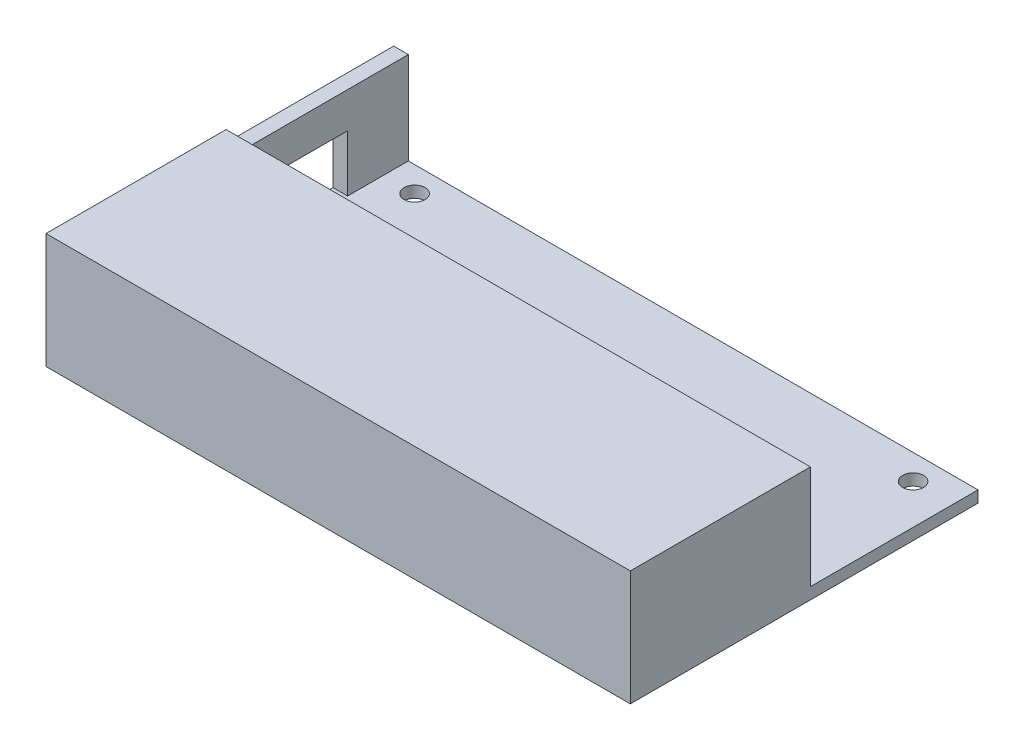
ISO-10303-21;
HEADER;
FILE_DESCRIPTION(('STEP AP214'),'2;1');
FILE_NAME('part.step','',(''),(''),'','','');
FILE_SCHEMA(('AUTOMOTIVE_DESIGN { 1 0 10303 214 1 1 1 1 }'));
ENDSEC;
DATA;
#1=APPLICATION_CONTEXT('core data for automotive mechanical design processes');
#2=APPLICATION_PROTOCOL_DEFINITION('international standard','automotive_design',2000,#1);
#3=PRODUCT_CONTEXT('',#1,'mechanical');
#4=PRODUCT('Part','Part','',(#3));
#5=PRODUCT_RELATED_PRODUCT_CATEGORY('part','',(#4));
#6=PRODUCT_DEFINITION_FORMATION('','',#4);
#7=PRODUCT_DEFINITION_CONTEXT('part definition',#1,'design');
#8=PRODUCT_DEFINITION('design','',#6,#7);
#9=PRODUCT_DEFINITION_SHAPE('','',#8);
#10=(LENGTH_UNIT() NAMED_UNIT(*) SI_UNIT(.MILLI.,.METRE.));
#11=(NAMED_UNIT(*) PLANE_ANGLE_UNIT() SI_UNIT($,.RADIAN.));
#12=(NAMED_UNIT(*) SI_UNIT($,.STERADIAN.) SOLID_ANGLE_UNIT());
#13=UNCERTAINTY_MEASURE_WITH_UNIT(LENGTH_MEASURE(1.E-05),#10,'distance_accuracy_value','');
#14=(GEOMETRIC_REPRESENTATION_CONTEXT(3) GLOBAL_UNCERTAINTY_ASSIGNED_CONTEXT((#13)) GLOBAL_UNIT_ASSIGNED_CONTEXT((#10,
#11,#12)) REPRESENTATION_CONTEXT('',''));
#15=CARTESIAN_POINT('',(0.,0.,0.));
#16=DIRECTION('',(0.,0.,1.));
#17=DIRECTION('',(1.,0.,0.));
#18=AXIS2_PLACEMENT_3D('',#15,#16,#17);
#19=CARTESIAN_POINT('',(69.75,27.5,41.5));
#20=DIRECTION('',(-1.,0.,0.));
#21=DIRECTION('',(0.,0.,1.));
#22=AXIS2_PLACEMENT_3D('',#19,#20,#21);
#23=PLANE('',#22);
#24=DIRECTION('',(0.,-1.,0.));
#25=VECTOR('',#24,1.);
#26=CARTESIAN_POINT('',(69.75,27.5,-41.5));
#27=LINE('',#26,#25);
#28=CARTESIAN_POINT('',(69.75,2.75,-41.5));
#29=VERTEX_POINT('',#28);
#30=CARTESIAN_POINT('',(69.75,0.,-41.5));
#31=VERTEX_POINT('',#30);
#32=EDGE_CURVE('E11',#29,#31,#27,.T.);
#33=ORIENTED_EDGE('',*,*,#32,.F.);
#34=DIRECTION('',(0.,0.,-1.));
#35=VECTOR('',#34,1.);
#36=CARTESIAN_POINT('',(69.75,2.75,-1.5));
#37=LINE('',#36,#35);
#38=CARTESIAN_POINT('',(69.75,2.75,-1.5));
#39=VERTEX_POINT('',#38);
#40=EDGE_CURVE('E362',#39,#29,#37,.T.);
#41=ORIENTED_EDGE('',*,*,#40,.F.);
#42=DIRECTION('',(0.,-1.,0.));
#43=VECTOR('',#42,1.);
#44=CARTESIAN_POINT('',(69.75,23.25,-1.5));
#45=LINE('',#44,#43);
#46=CARTESIAN_POINT('',(69.75,27.5,-1.5));
#47=VERTEX_POINT('',#46);
#48=EDGE_CURVE('E354',#47,#39,#45,.T.);
#49=ORIENTED_EDGE('',*,*,#48,.F.);
#50=DIRECTION('',(0.,0.,-1.));
#51=VECTOR('',#50,1.);
#52=CARTESIAN_POINT('',(69.75,27.5,41.5));
#53=LINE('',#52,#51);
#54=CARTESIAN_POINT('',(69.75,27.5,41.5));
#55=VERTEX_POINT('',#54);
#56=EDGE_CURVE('E225',#55,#47,#53,.T.);
#57=ORIENTED_EDGE('',*,*,#56,.F.);
#58=DIRECTION('',(0.,-1.,0.));
#59=VECTOR('',#58,1.);
#60=CARTESIAN_POINT('',(69.75,27.5,41.5));
#61=LINE('',#60,#59);
#62=CARTESIAN_POINT('',(69.75,0.,41.5));
#63=VERTEX_POINT('',#62);
#64=EDGE_CURVE('E226',#55,#63,#61,.T.);
#65=ORIENTED_EDGE('',*,*,#64,.T.);
#66=DIRECTION('',(0.,0.,-1.));
#67=VECTOR('',#66,1.);
#68=CARTESIAN_POINT('',(69.75,0.,41.5));
#69=LINE('',#68,#67);
#70=EDGE_CURVE('E219',#63,#31,#69,.T.);
#71=ORIENTED_EDGE('',*,*,#70,.T.);
#72=EDGE_LOOP('',(#33,#41,#49,#57,#65,#71));
#73=FACE_BOUND('',#72,.T.);
#74=ADVANCED_FACE('F39',(#73),#23,.F.);
#75=CARTESIAN_POINT('',(-69.75,27.5,-41.5));
#76=DIRECTION('',(0.,0.,1.));
#77=DIRECTION('',(1.,0.,0.));
#78=AXIS2_PLACEMENT_3D('',#75,#76,#77);
#79=PLANE('',#78);
#80=DIRECTION('',(-1.,0.,0.));
#81=VECTOR('',#80,1.);
#82=CARTESIAN_POINT('',(-66.2541319088615,2.74999999999999,-41.5));
#83=LINE('',#82,#81);
#84=CARTESIAN_POINT('',(-66.2541319088615,2.74999999999999,-41.5));
#85=VERTEX_POINT('',#84);
#86=EDGE_CURVE('E366',#29,#85,#83,.T.);
#87=ORIENTED_EDGE('',*,*,#86,.F.);
#88=ORIENTED_EDGE('',*,*,#32,.T.);
#89=DIRECTION('',(-1.,0.,0.));
#90=VECTOR('',#89,1.);
#91=CARTESIAN_POINT('',(-69.75,0.,-41.5));
#92=LINE('',#91,#90);
#93=CARTESIAN_POINT('',(-69.75,0.,-41.5));
#94=VERTEX_POINT('',#93);
#95=EDGE_CURVE('E214',#31,#94,#92,.T.);
#96=ORIENTED_EDGE('',*,*,#95,.T.);
#97=DIRECTION('',(0.,-1.,0.));
#98=VECTOR('',#97,1.);
#99=CARTESIAN_POINT('',(-69.75,27.5,-41.5));
#100=LINE('',#99,#98);
#101=CARTESIAN_POINT('',(-69.75,24.75,-41.5));
#102=VERTEX_POINT('',#101);
#103=EDGE_CURVE('E47',#102,#94,#100,.T.);
#104=ORIENTED_EDGE('',*,*,#103,.F.);
#105=DIRECTION('',(-1.,0.,0.));
#106=VECTOR('',#105,1.);
#107=CARTESIAN_POINT('',(-67.373989773948,24.75,-41.5));
#108=LINE('',#107,#106);
#109=CARTESIAN_POINT('',(-66.2541319088615,24.75,-41.5));
#110=VERTEX_POINT('',#109);
#111=EDGE_CURVE('E192',#110,#102,#108,.T.);
#112=ORIENTED_EDGE('',*,*,#111,.F.);
#113=DIRECTION('',(0.,1.,0.));
#114=VECTOR('',#113,1.);
#115=CARTESIAN_POINT('',(-66.2541319088615,2.74999999999999,-41.5));
#116=LINE('',#115,#114);
#117=EDGE_CURVE('E374',#85,#110,#116,.T.);
#118=ORIENTED_EDGE('',*,*,#117,.F.);
#119=EDGE_LOOP('',(#87,#88,#96,#104,#112,#118));
#120=FACE_BOUND('',#119,.T.);
#121=ADVANCED_FACE('F243',(#120),#79,.F.);
#122=CARTESIAN_POINT('',(-69.75,27.5,41.5));
#123=DIRECTION('',(1.,0.,0.));
#124=DIRECTION('',(0.,0.,-1.));
#125=AXIS2_PLACEMENT_3D('',#122,#123,#124);
#126=PLANE('',#125);
#127=DIRECTION('',(0.,0.,1.));
#128=VECTOR('',#127,1.);
#129=CARTESIAN_POINT('',(-69.75,0.,41.5));
#130=LINE('',#129,#128);
#131=CARTESIAN_POINT('',(-69.75,0.,-5.50000000000001));
#132=VERTEX_POINT('',#131);
#133=EDGE_CURVE('E213',#94,#132,#130,.T.);
#134=ORIENTED_EDGE('',*,*,#133,.T.);
#135=DIRECTION('',(0.,-1.,0.));
#136=VECTOR('',#135,1.);
#137=CARTESIAN_POINT('',(-69.75,2.74999999999999,-5.50000000000001));
#138=LINE('',#137,#136);
#139=CARTESIAN_POINT('',(-69.75,16.25,-5.50000000000001));
#140=VERTEX_POINT('',#139);
#141=EDGE_CURVE('E284',#140,#132,#138,.T.);
#142=ORIENTED_EDGE('',*,*,#141,.F.);
#143=DIRECTION('',(0.,0.,-1.));
#144=VECTOR('',#143,1.);
#145=CARTESIAN_POINT('',(-69.75,16.25,24.5));
#146=LINE('',#145,#144);
#147=CARTESIAN_POINT('',(-69.75,16.25,24.5));
#148=VERTEX_POINT('',#147);
#149=EDGE_CURVE('E188',#148,#140,#146,.T.);
#150=ORIENTED_EDGE('',*,*,#149,.F.);
#151=DIRECTION('',(0.,1.,0.));
#152=VECTOR('',#151,1.);
#153=CARTESIAN_POINT('',(-69.75,2.75,24.5));
#154=LINE('',#153,#152);
#155=CARTESIAN_POINT('',(-69.75,0.,24.5));
#156=VERTEX_POINT('',#155);
#157=EDGE_CURVE('E178',#156,#148,#154,.T.);
#158=ORIENTED_EDGE('',*,*,#157,.F.);
#159=CARTESIAN_POINT('',(-69.75,0.,41.5));
#160=VERTEX_POINT('',#159);
#161=EDGE_CURVE('E185',#156,#160,#130,.T.);
#162=ORIENTED_EDGE('',*,*,#161,.T.);
#163=DIRECTION('',(0.,-1.,0.));
#164=VECTOR('',#163,1.);
#165=CARTESIAN_POINT('',(-69.75,27.5,41.5));
#166=LINE('',#165,#164);
#167=CARTESIAN_POINT('',(-69.75,27.5,41.5));
#168=VERTEX_POINT('',#167);
#169=EDGE_CURVE('E230',#168,#160,#166,.T.);
#170=ORIENTED_EDGE('',*,*,#169,.F.);
#171=DIRECTION('',(0.,0.,1.));
#172=VECTOR('',#171,1.);
#173=CARTESIAN_POINT('',(-69.75,27.5,41.5));
#174=LINE('',#173,#172);
#175=CARTESIAN_POINT('',(-69.75,27.5,-1.5));
#176=VERTEX_POINT('',#175);
#177=EDGE_CURVE('E414',#176,#168,#174,.T.);
#178=ORIENTED_EDGE('',*,*,#177,.F.);
#179=DIRECTION('',(0.,1.,0.));
#180=VECTOR('',#179,1.);
#181=CARTESIAN_POINT('',(-69.75,24.75,-1.5));
#182=LINE('',#181,#180);
#183=CARTESIAN_POINT('',(-69.75,24.75,-1.5));
#184=VERTEX_POINT('',#183);
#185=EDGE_CURVE('E348',#184,#176,#182,.T.);
#186=ORIENTED_EDGE('',*,*,#185,.F.);
#187=DIRECTION('',(0.,0.,-1.));
#188=VECTOR('',#187,1.);
#189=CARTESIAN_POINT('',(-69.75,24.75,-1.5));
#190=LINE('',#189,#188);
#191=EDGE_CURVE('E239',#184,#102,#190,.T.);
#192=ORIENTED_EDGE('',*,*,#191,.T.);
#193=ORIENTED_EDGE('',*,*,#103,.T.);
#194=EDGE_LOOP('',(#134,#142,#150,#158,#162,#170,#178,#186,#192,#193));
#195=FACE_BOUND('',#194,.T.);
#196=DIRECTION('',(0.,0.,-1.));
#197=VECTOR('',#196,1.);
#198=CARTESIAN_POINT('',(-69.75,16.25,-10.5));
#199=LINE('',#198,#197);
#200=CARTESIAN_POINT('',(-69.75,16.25,-10.5));
#201=VERTEX_POINT('',#200);
#202=CARTESIAN_POINT('',(-69.75,16.25,-27.));
#203=VERTEX_POINT('',#202);
#204=EDGE_CURVE('E311',#201,#203,#199,.T.);
#205=ORIENTED_EDGE('',*,*,#204,.F.);
#206=DIRECTION('',(0.,1.,0.));
#207=VECTOR('',#206,1.);
#208=CARTESIAN_POINT('',(-69.75,2.74999999999999,-10.5));
#209=LINE('',#208,#207);
#210=CARTESIAN_POINT('',(-69.75,2.74999999999999,-10.5));
#211=VERTEX_POINT('',#210);
#212=EDGE_CURVE('E315',#211,#201,#209,.T.);
#213=ORIENTED_EDGE('',*,*,#212,.F.);
#214=DIRECTION('',(0.,0.,1.));
#215=VECTOR('',#214,1.);
#216=CARTESIAN_POINT('',(-69.75,2.74999999999999,-10.5));
#217=LINE('',#216,#215);
#218=CARTESIAN_POINT('',(-69.75,2.74999999999999,-27.));
#219=VERTEX_POINT('',#218);
#220=EDGE_CURVE('E295',#219,#211,#217,.T.);
#221=ORIENTED_EDGE('',*,*,#220,.F.);
#222=DIRECTION('',(0.,-1.,0.));
#223=VECTOR('',#222,1.);
#224=CARTESIAN_POINT('',(-69.75,2.74999999999999,-27.));
#225=LINE('',#224,#223);
#226=EDGE_CURVE('E308',#203,#219,#225,.T.);
#227=ORIENTED_EDGE('',*,*,#226,.F.);
#228=EDGE_LOOP('',(#205,#213,#221,#227));
#229=FACE_BOUND('',#228,.T.);
#230=ADVANCED_FACE('F181',(#195,#229),#126,.F.);
#231=CARTESIAN_POINT('',(-69.75,27.5,41.5));
#232=DIRECTION('',(0.,0.,-1.));
#233=DIRECTION('',(-1.,0.,0.));
#234=AXIS2_PLACEMENT_3D('',#231,#232,#233);
#235=PLANE('',#234);
#236=DIRECTION('',(1.,0.,0.));
#237=VECTOR('',#236,1.);
#238=CARTESIAN_POINT('',(-69.75,0.,41.5));
#239=LINE('',#238,#237);
#240=EDGE_CURVE('E211',#160,#63,#239,.T.);
#241=ORIENTED_EDGE('',*,*,#240,.T.);
#242=ORIENTED_EDGE('',*,*,#64,.F.);
#243=DIRECTION('',(1.,0.,0.));
#244=VECTOR('',#243,1.);
#245=CARTESIAN_POINT('',(-69.75,27.5,41.5));
#246=LINE('',#245,#244);
#247=EDGE_CURVE('E231',#168,#55,#246,.T.);
#248=ORIENTED_EDGE('',*,*,#247,.F.);
#249=ORIENTED_EDGE('',*,*,#169,.T.);
#250=EDGE_LOOP('',(#241,#242,#248,#249));
#251=FACE_BOUND('',#250,.T.);
#252=ADVANCED_FACE('F426',(#251),#235,.F.);
#253=CARTESIAN_POINT('',(0.,27.5,0.));
#254=DIRECTION('',(0.,-1.,0.));
#255=DIRECTION('',(0.,0.,-1.));
#256=AXIS2_PLACEMENT_3D('',#253,#254,#255);
#257=PLANE('',#256);
#258=ORIENTED_EDGE('',*,*,#56,.T.);
#259=DIRECTION('',(1.,0.,0.));
#260=VECTOR('',#259,1.);
#261=CARTESIAN_POINT('',(-69.75,27.5,-1.5));
#262=LINE('',#261,#260);
#263=EDGE_CURVE('E351',#176,#47,#262,.T.);
#264=ORIENTED_EDGE('',*,*,#263,.F.);
#265=ORIENTED_EDGE('',*,*,#177,.T.);
#266=ORIENTED_EDGE('',*,*,#247,.T.);
#267=EDGE_LOOP('',(#258,#264,#265,#266));
#268=FACE_BOUND('',#267,.T.);
#269=ADVANCED_FACE('F430',(#268),#257,.F.);
#270=CARTESIAN_POINT('',(0.,0.,0.));
#271=DIRECTION('',(0.,-1.,0.));
#272=DIRECTION('',(0.,0.,-1.));
#273=AXIS2_PLACEMENT_3D('',#270,#271,#272);
#274=PLANE('',#273);
#275=CARTESIAN_POINT('',(60.25,0.,-35.5));
#276=DIRECTION('',(0.,1.,0.));
#277=DIRECTION('',(0.,0.,1.));
#278=AXIS2_PLACEMENT_3D('',#275,#276,#277);
#279=CIRCLE('',#278,2.50000000000001);
#280=CARTESIAN_POINT('',(60.25,0.,-33.));
#281=VERTEX_POINT('',#280);
#282=EDGE_CURVE('E261',#281,#281,#279,.T.);
#283=ORIENTED_EDGE('',*,*,#282,.T.);
#284=EDGE_LOOP('',(#283));
#285=FACE_BOUND('',#284,.T.);
#286=DIRECTION('',(-1.,0.,0.));
#287=VECTOR('',#286,1.);
#288=CARTESIAN_POINT('',(-69.75,0.,-5.50000000000001));
#289=LINE('',#288,#287);
#290=CARTESIAN_POINT('',(-48.75,0.,-5.50000000000001));
#291=VERTEX_POINT('',#290);
#292=EDGE_CURVE('E247',#291,#132,#289,.T.);
#293=ORIENTED_EDGE('',*,*,#292,.T.);
#294=ORIENTED_EDGE('',*,*,#133,.F.);
#295=ORIENTED_EDGE('',*,*,#95,.F.);
#296=ORIENTED_EDGE('',*,*,#70,.F.);
#297=ORIENTED_EDGE('',*,*,#240,.F.);
#298=ORIENTED_EDGE('',*,*,#161,.F.);
#299=DIRECTION('',(1.,0.,0.));
#300=VECTOR('',#299,1.);
#301=CARTESIAN_POINT('',(-69.75,0.,24.5));
#302=LINE('',#301,#300);
#303=CARTESIAN_POINT('',(-48.75,0.,24.5));
#304=VERTEX_POINT('',#303);
#305=EDGE_CURVE('E195',#156,#304,#302,.T.);
#306=ORIENTED_EDGE('',*,*,#305,.T.);
#307=DIRECTION('',(0.,0.,-1.));
#308=VECTOR('',#307,1.);
#309=CARTESIAN_POINT('',(-48.75,0.,-5.50000000000001));
#310=LINE('',#309,#308);
#311=EDGE_CURVE('E203',#304,#291,#310,.T.);
#312=ORIENTED_EDGE('',*,*,#311,.T.);
#313=EDGE_LOOP('',(#293,#294,#295,#296,#297,#298,#306,#312));
#314=FACE_BOUND('',#313,.T.);
#315=CARTESIAN_POINT('',(-58.7541319088615,0.,-35.5));
#316=DIRECTION('',(0.,1.,0.));
#317=DIRECTION('',(0.,0.,1.));
#318=AXIS2_PLACEMENT_3D('',#315,#316,#317);
#319=CIRCLE('',#318,2.5);
#320=CARTESIAN_POINT('',(-58.7541319088615,0.,-33.));
#321=VERTEX_POINT('',#320);
#322=EDGE_CURVE('E277',#321,#321,#319,.T.);
#323=ORIENTED_EDGE('',*,*,#322,.T.);
#324=EDGE_LOOP('',(#323));
#325=FACE_BOUND('',#324,.T.);
#326=ADVANCED_FACE('F208',(#285,#314,#325),#274,.T.);
#327=CARTESIAN_POINT('',(66.2541319088616,2.74999999999999,38.5));
#328=DIRECTION('',(1.,0.,0.));
#329=DIRECTION('',(0.,0.,-1.));
#330=AXIS2_PLACEMENT_3D('',#327,#328,#329);
#331=PLANE('',#330);
#332=DIRECTION('',(0.,0.,-1.));
#333=VECTOR('',#332,1.);
#334=CARTESIAN_POINT('',(66.2541319088616,24.75,38.5));
#335=LINE('',#334,#333);
#336=CARTESIAN_POINT('',(66.2541319088616,24.75,38.5));
#337=VERTEX_POINT('',#336);
#338=CARTESIAN_POINT('',(66.2541319088616,24.75,-1.5));
#339=VERTEX_POINT('',#338);
#340=EDGE_CURVE('E393',#337,#339,#335,.T.);
#341=ORIENTED_EDGE('',*,*,#340,.T.);
#342=DIRECTION('',(0.,1.,0.));
#343=VECTOR('',#342,1.);
#344=CARTESIAN_POINT('',(66.2541319088616,2.74999999999999,-1.5));
#345=LINE('',#344,#343);
#346=CARTESIAN_POINT('',(66.2541319088616,2.74999999999999,-1.5));
#347=VERTEX_POINT('',#346);
#348=EDGE_CURVE('E340',#347,#339,#345,.T.);
#349=ORIENTED_EDGE('',*,*,#348,.F.);
#350=DIRECTION('',(0.,0.,-1.));
#351=VECTOR('',#350,1.);
#352=CARTESIAN_POINT('',(66.2541319088616,2.74999999999999,38.5));
#353=LINE('',#352,#351);
#354=CARTESIAN_POINT('',(66.2541319088616,2.74999999999999,38.5));
#355=VERTEX_POINT('',#354);
#356=EDGE_CURVE('E386',#355,#347,#353,.T.);
#357=ORIENTED_EDGE('',*,*,#356,.F.);
#358=DIRECTION('',(0.,-1.,0.));
#359=VECTOR('',#358,1.);
#360=CARTESIAN_POINT('',(66.2541319088616,2.74999999999999,38.5));
#361=LINE('',#360,#359);
#362=EDGE_CURVE('E369',#337,#355,#361,.T.);
#363=ORIENTED_EDGE('',*,*,#362,.F.);
#364=EDGE_LOOP('',(#341,#349,#357,#363));
#365=FACE_BOUND('',#364,.T.);
#366=ADVANCED_FACE('F441',(#365),#331,.F.);
#367=CARTESIAN_POINT('',(-66.2541319088615,24.75,38.5));
#368=DIRECTION('',(0.,1.,0.));
#369=DIRECTION('',(0.,0.,1.));
#370=AXIS2_PLACEMENT_3D('',#367,#368,#369);
#371=PLANE('',#370);
#372=DIRECTION('',(0.,0.,-1.));
#373=VECTOR('',#372,1.);
#374=CARTESIAN_POINT('',(-66.2541319088615,24.75,38.5));
#375=LINE('',#374,#373);
#376=CARTESIAN_POINT('',(-66.2541319088615,24.75,38.5));
#377=VERTEX_POINT('',#376);
#378=CARTESIAN_POINT('',(-66.2541319088615,24.75,-1.5));
#379=VERTEX_POINT('',#378);
#380=EDGE_CURVE('E397',#377,#379,#375,.T.);
#381=ORIENTED_EDGE('',*,*,#380,.T.);
#382=DIRECTION('',(-1.,0.,0.));
#383=VECTOR('',#382,1.);
#384=CARTESIAN_POINT('',(66.2541319088616,24.75,-1.5));
#385=LINE('',#384,#383);
#386=EDGE_CURVE('E344',#339,#379,#385,.T.);
#387=ORIENTED_EDGE('',*,*,#386,.F.);
#388=ORIENTED_EDGE('',*,*,#340,.F.);
#389=DIRECTION('',(1.,0.,0.));
#390=VECTOR('',#389,1.);
#391=CARTESIAN_POINT('',(-66.2541319088615,24.75,38.5));
#392=LINE('',#391,#390);
#393=EDGE_CURVE('E382',#377,#337,#392,.T.);
#394=ORIENTED_EDGE('',*,*,#393,.F.);
#395=EDGE_LOOP('',(#381,#387,#388,#394));
#396=FACE_BOUND('',#395,.T.);
#397=ADVANCED_FACE('F445',(#396),#371,.F.);
#398=CARTESIAN_POINT('',(-66.2541319088615,2.74999999999999,38.5));
#399=DIRECTION('',(-1.,0.,0.));
#400=DIRECTION('',(0.,0.,1.));
#401=AXIS2_PLACEMENT_3D('',#398,#399,#400);
#402=PLANE('',#401);
#403=DIRECTION('',(0.,0.,-1.));
#404=VECTOR('',#403,1.);
#405=CARTESIAN_POINT('',(-66.2541319088615,2.74999999999999,38.5));
#406=LINE('',#405,#404);
#407=CARTESIAN_POINT('',(-66.2541319088615,2.74999999999999,38.5));
#408=VERTEX_POINT('',#407);
#409=CARTESIAN_POINT('',(-66.2541319088615,2.74999999999999,24.5));
#410=VERTEX_POINT('',#409);
#411=EDGE_CURVE('E402',#408,#410,#406,.T.);
#412=ORIENTED_EDGE('',*,*,#411,.T.);
#413=DIRECTION('',(0.,-1.,0.));
#414=VECTOR('',#413,1.);
#415=CARTESIAN_POINT('',(-66.2541319088615,2.75,24.5));
#416=LINE('',#415,#414);
#417=CARTESIAN_POINT('',(-66.2541319088615,16.25,24.5));
#418=VERTEX_POINT('',#417);
#419=EDGE_CURVE('E290',#418,#410,#416,.T.);
#420=ORIENTED_EDGE('',*,*,#419,.F.);
#421=DIRECTION('',(0.,0.,1.));
#422=VECTOR('',#421,1.);
#423=CARTESIAN_POINT('',(-66.2541319088615,16.25,24.5));
#424=LINE('',#423,#422);
#425=CARTESIAN_POINT('',(-66.2541319088615,16.25,-5.50000000000001));
#426=VERTEX_POINT('',#425);
#427=EDGE_CURVE('E299',#426,#418,#424,.T.);
#428=ORIENTED_EDGE('',*,*,#427,.F.);
#429=DIRECTION('',(0.,1.,0.));
#430=VECTOR('',#429,1.);
#431=CARTESIAN_POINT('',(-66.2541319088615,2.74999999999999,-5.50000000000001));
#432=LINE('',#431,#430);
#433=CARTESIAN_POINT('',(-66.2541319088615,2.74999999999999,-5.50000000000001));
#434=VERTEX_POINT('',#433);
#435=EDGE_CURVE('E294',#434,#426,#432,.T.);
#436=ORIENTED_EDGE('',*,*,#435,.F.);
#437=CARTESIAN_POINT('',(-66.2541319088615,2.74999999999999,-10.5));
#438=VERTEX_POINT('',#437);
#439=EDGE_CURVE('E406',#434,#438,#406,.T.);
#440=ORIENTED_EDGE('',*,*,#439,.T.);
#441=DIRECTION('',(0.,-1.,0.));
#442=VECTOR('',#441,1.);
#443=CARTESIAN_POINT('',(-66.2541319088615,2.74999999999999,-10.5));
#444=LINE('',#443,#442);
#445=CARTESIAN_POINT('',(-66.2541319088615,16.25,-10.5));
#446=VERTEX_POINT('',#445);
#447=EDGE_CURVE('E62',#446,#438,#444,.T.);
#448=ORIENTED_EDGE('',*,*,#447,.F.);
#449=DIRECTION('',(0.,0.,1.));
#450=VECTOR('',#449,1.);
#451=CARTESIAN_POINT('',(-66.2541319088615,16.25,-10.5));
#452=LINE('',#451,#450);
#453=CARTESIAN_POINT('',(-66.2541319088615,16.25,-27.));
#454=VERTEX_POINT('',#453);
#455=EDGE_CURVE('E324',#454,#446,#452,.T.);
#456=ORIENTED_EDGE('',*,*,#455,.F.);
#457=DIRECTION('',(0.,1.,0.));
#458=VECTOR('',#457,1.);
#459=CARTESIAN_POINT('',(-66.2541319088615,2.74999999999999,-27.));
#460=LINE('',#459,#458);
#461=CARTESIAN_POINT('',(-66.2541319088615,2.74999999999999,-27.));
#462=VERTEX_POINT('',#461);
#463=EDGE_CURVE('E320',#462,#454,#460,.T.);
#464=ORIENTED_EDGE('',*,*,#463,.F.);
#465=EDGE_CURVE('E407',#462,#85,#406,.T.);
#466=ORIENTED_EDGE('',*,*,#465,.T.);
#467=ORIENTED_EDGE('',*,*,#117,.T.);
#468=EDGE_CURVE('E401',#379,#110,#375,.T.);
#469=ORIENTED_EDGE('',*,*,#468,.F.);
#470=ORIENTED_EDGE('',*,*,#380,.F.);
#471=DIRECTION('',(0.,1.,0.));
#472=VECTOR('',#471,1.);
#473=CARTESIAN_POINT('',(-66.2541319088615,2.74999999999999,38.5));
#474=LINE('',#473,#472);
#475=EDGE_CURVE('E378',#408,#377,#474,.T.);
#476=ORIENTED_EDGE('',*,*,#475,.F.);
#477=EDGE_LOOP('',(#412,#420,#428,#436,#440,#448,#456,#464,#466,#467,#469,#470,#476));
#478=FACE_BOUND('',#477,.T.);
#479=ADVANCED_FACE('F448',(#478),#402,.F.);
#480=CARTESIAN_POINT('',(-66.2541319088615,2.74999999999999,38.5));
#481=DIRECTION('',(0.,-1.,0.));
#482=DIRECTION('',(0.,0.,-1.));
#483=AXIS2_PLACEMENT_3D('',#480,#481,#482);
#484=PLANE('',#483);
#485=CARTESIAN_POINT('',(60.25,2.74999999999999,-35.5));
#486=DIRECTION('',(0.,1.,0.));
#487=DIRECTION('',(0.,0.,1.));
#488=AXIS2_PLACEMENT_3D('',#485,#486,#487);
#489=CIRCLE('',#488,2.50000000000001);
#490=CARTESIAN_POINT('',(60.25,2.74999999999999,-33.));
#491=VERTEX_POINT('',#490);
#492=EDGE_CURVE('E273',#491,#491,#489,.T.);
#493=ORIENTED_EDGE('',*,*,#492,.F.);
#494=EDGE_LOOP('',(#493));
#495=FACE_BOUND('',#494,.T.);
#496=CARTESIAN_POINT('',(-58.7541319088615,2.74999999999999,-35.5));
#497=DIRECTION('',(0.,1.,0.));
#498=DIRECTION('',(0.,0.,1.));
#499=AXIS2_PLACEMENT_3D('',#496,#497,#498);
#500=CIRCLE('',#499,2.5);
#501=CARTESIAN_POINT('',(-58.7541319088615,2.74999999999999,-33.));
#502=VERTEX_POINT('',#501);
#503=EDGE_CURVE('E268',#502,#502,#500,.T.);
#504=ORIENTED_EDGE('',*,*,#503,.F.);
#505=EDGE_LOOP('',(#504));
#506=FACE_BOUND('',#505,.T.);
#507=ORIENTED_EDGE('',*,*,#439,.F.);
#508=DIRECTION('',(-1.,0.,0.));
#509=VECTOR('',#508,1.);
#510=CARTESIAN_POINT('',(-69.75,2.74999999999999,-5.50000000000001));
#511=LINE('',#510,#509);
#512=CARTESIAN_POINT('',(-48.75,2.74999999999999,-5.50000000000001));
#513=VERTEX_POINT('',#512);
#514=EDGE_CURVE('E204',#513,#434,#511,.T.);
#515=ORIENTED_EDGE('',*,*,#514,.F.);
#516=DIRECTION('',(0.,0.,-1.));
#517=VECTOR('',#516,1.);
#518=CARTESIAN_POINT('',(-48.75,2.74999999999999,-5.50000000000001));
#519=LINE('',#518,#517);
#520=CARTESIAN_POINT('',(-48.75,2.74999999999999,24.5));
#521=VERTEX_POINT('',#520);
#522=EDGE_CURVE('E260',#521,#513,#519,.T.);
#523=ORIENTED_EDGE('',*,*,#522,.F.);
#524=DIRECTION('',(1.,0.,0.));
#525=VECTOR('',#524,1.);
#526=CARTESIAN_POINT('',(-69.75,2.74999999999999,24.5));
#527=LINE('',#526,#525);
#528=EDGE_CURVE('E257',#410,#521,#527,.T.);
#529=ORIENTED_EDGE('',*,*,#528,.F.);
#530=ORIENTED_EDGE('',*,*,#411,.F.);
#531=DIRECTION('',(-1.,0.,0.));
#532=VECTOR('',#531,1.);
#533=CARTESIAN_POINT('',(-66.2541319088615,2.74999999999999,38.5));
#534=LINE('',#533,#532);
#535=EDGE_CURVE('E373',#355,#408,#534,.T.);
#536=ORIENTED_EDGE('',*,*,#535,.F.);
#537=ORIENTED_EDGE('',*,*,#356,.T.);
#538=DIRECTION('',(-1.,0.,0.));
#539=VECTOR('',#538,1.);
#540=CARTESIAN_POINT('',(66.2541319088616,2.74999999999999,-1.5));
#541=LINE('',#540,#539);
#542=EDGE_CURVE('E357',#39,#347,#541,.T.);
#543=ORIENTED_EDGE('',*,*,#542,.F.);
#544=ORIENTED_EDGE('',*,*,#40,.T.);
#545=ORIENTED_EDGE('',*,*,#86,.T.);
#546=ORIENTED_EDGE('',*,*,#465,.F.);
#547=DIRECTION('',(1.,0.,0.));
#548=VECTOR('',#547,1.);
#549=CARTESIAN_POINT('',(-102.647568299192,2.74999999999999,-27.));
#550=LINE('',#549,#548);
#551=EDGE_CURVE('E54',#219,#462,#550,.T.);
#552=ORIENTED_EDGE('',*,*,#551,.F.);
#553=ORIENTED_EDGE('',*,*,#220,.T.);
#554=DIRECTION('',(1.,0.,0.));
#555=VECTOR('',#554,1.);
#556=CARTESIAN_POINT('',(-102.647568299192,2.74999999999999,-10.5));
#557=LINE('',#556,#555);
#558=EDGE_CURVE('E328',#211,#438,#557,.T.);
#559=ORIENTED_EDGE('',*,*,#558,.T.);
#560=EDGE_LOOP('',(#507,#515,#523,#529,#530,#536,#537,#543,#544,#545,#546,#552,#553,#559));
#561=FACE_BOUND('',#560,.T.);
#562=ADVANCED_FACE('F435',(#495,#506,#561),#484,.F.);
#563=CARTESIAN_POINT('',(0.,0.,38.5));
#564=DIRECTION('',(0.,0.,-1.));
#565=DIRECTION('',(-1.,0.,0.));
#566=AXIS2_PLACEMENT_3D('',#563,#564,#565);
#567=PLANE('',#566);
#568=ORIENTED_EDGE('',*,*,#362,.T.);
#569=ORIENTED_EDGE('',*,*,#535,.T.);
#570=ORIENTED_EDGE('',*,*,#475,.T.);
#571=ORIENTED_EDGE('',*,*,#393,.T.);
#572=EDGE_LOOP('',(#568,#569,#570,#571));
#573=FACE_BOUND('',#572,.T.);
#574=ADVANCED_FACE('F510',(#573),#567,.T.);
#575=CARTESIAN_POINT('',(-67.373989773948,24.75,-1.5));
#576=DIRECTION('',(0.,-1.,0.));
#577=DIRECTION('',(0.,0.,-1.));
#578=AXIS2_PLACEMENT_3D('',#575,#576,#577);
#579=PLANE('',#578);
#580=ORIENTED_EDGE('',*,*,#111,.T.);
#581=ORIENTED_EDGE('',*,*,#191,.F.);
#582=EDGE_CURVE('E343',#379,#184,#385,.T.);
#583=ORIENTED_EDGE('',*,*,#582,.F.);
#584=ORIENTED_EDGE('',*,*,#468,.T.);
#585=EDGE_LOOP('',(#580,#581,#583,#584));
#586=FACE_BOUND('',#585,.T.);
#587=ADVANCED_FACE('F518',(#586),#579,.F.);
#588=CARTESIAN_POINT('',(0.,0.,-1.5));
#589=DIRECTION('',(0.,0.,1.));
#590=DIRECTION('',(1.,0.,0.));
#591=AXIS2_PLACEMENT_3D('',#588,#589,#590);
#592=PLANE('',#591);
#593=ORIENTED_EDGE('',*,*,#348,.T.);
#594=ORIENTED_EDGE('',*,*,#386,.T.);
#595=ORIENTED_EDGE('',*,*,#582,.T.);
#596=ORIENTED_EDGE('',*,*,#185,.T.);
#597=ORIENTED_EDGE('',*,*,#263,.T.);
#598=ORIENTED_EDGE('',*,*,#48,.T.);
#599=ORIENTED_EDGE('',*,*,#542,.T.);
#600=EDGE_LOOP('',(#593,#594,#595,#596,#597,#598,#599));
#601=FACE_BOUND('',#600,.T.);
#602=ADVANCED_FACE('F432',(#601),#592,.F.);
#603=CARTESIAN_POINT('',(-102.647568299192,2.74999999999999,-10.5));
#604=DIRECTION('',(0.,0.,1.));
#605=DIRECTION('',(1.,0.,0.));
#606=AXIS2_PLACEMENT_3D('',#603,#604,#605);
#607=PLANE('',#606);
#608=ORIENTED_EDGE('',*,*,#212,.T.);
#609=DIRECTION('',(1.,0.,0.));
#610=VECTOR('',#609,1.);
#611=CARTESIAN_POINT('',(-102.647568299192,16.25,-10.5));
#612=LINE('',#611,#610);
#613=EDGE_CURVE('E312',#201,#446,#612,.T.);
#614=ORIENTED_EDGE('',*,*,#613,.T.);
#615=ORIENTED_EDGE('',*,*,#447,.T.);
#616=ORIENTED_EDGE('',*,*,#558,.F.);
#617=EDGE_LOOP('',(#608,#614,#615,#616));
#618=FACE_BOUND('',#617,.T.);
#619=ADVANCED_FACE('F465',(#618),#607,.F.);
#620=CARTESIAN_POINT('',(-102.647568299192,16.25,-10.5));
#621=DIRECTION('',(0.,1.,0.));
#622=DIRECTION('',(0.,0.,1.));
#623=AXIS2_PLACEMENT_3D('',#620,#621,#622);
#624=PLANE('',#623);
#625=ORIENTED_EDGE('',*,*,#204,.T.);
#626=DIRECTION('',(1.,0.,0.));
#627=VECTOR('',#626,1.);
#628=CARTESIAN_POINT('',(-102.647568299192,16.25,-27.));
#629=LINE('',#628,#627);
#630=EDGE_CURVE('E331',#203,#454,#629,.T.);
#631=ORIENTED_EDGE('',*,*,#630,.T.);
#632=ORIENTED_EDGE('',*,*,#455,.T.);
#633=ORIENTED_EDGE('',*,*,#613,.F.);
#634=EDGE_LOOP('',(#625,#631,#632,#633));
#635=FACE_BOUND('',#634,.T.);
#636=ADVANCED_FACE('F468',(#635),#624,.F.);
#637=CARTESIAN_POINT('',(-102.647568299192,2.74999999999999,-27.));
#638=DIRECTION('',(0.,0.,-1.));
#639=DIRECTION('',(-1.,0.,0.));
#640=AXIS2_PLACEMENT_3D('',#637,#638,#639);
#641=PLANE('',#640);
#642=ORIENTED_EDGE('',*,*,#226,.T.);
#643=ORIENTED_EDGE('',*,*,#551,.T.);
#644=ORIENTED_EDGE('',*,*,#463,.T.);
#645=ORIENTED_EDGE('',*,*,#630,.F.);
#646=EDGE_LOOP('',(#642,#643,#644,#645));
#647=FACE_BOUND('',#646,.T.);
#648=ADVANCED_FACE('F460',(#647),#641,.F.);
#649=CARTESIAN_POINT('',(-102.647568299192,2.75,24.5));
#650=DIRECTION('',(0.,0.,1.));
#651=DIRECTION('',(1.,0.,0.));
#652=AXIS2_PLACEMENT_3D('',#649,#650,#651);
#653=PLANE('',#652);
#654=ORIENTED_EDGE('',*,*,#157,.T.);
#655=DIRECTION('',(1.,0.,0.));
#656=VECTOR('',#655,1.);
#657=CARTESIAN_POINT('',(-102.647568299192,16.25,24.5));
#658=LINE('',#657,#656);
#659=EDGE_CURVE('E287',#148,#418,#658,.T.);
#660=ORIENTED_EDGE('',*,*,#659,.T.);
#661=ORIENTED_EDGE('',*,*,#419,.T.);
#662=ORIENTED_EDGE('',*,*,#528,.T.);
#663=DIRECTION('',(0.,1.,0.));
#664=VECTOR('',#663,1.);
#665=CARTESIAN_POINT('',(-48.75,0.,24.5));
#666=LINE('',#665,#664);
#667=EDGE_CURVE('E198',#304,#521,#666,.T.);
#668=ORIENTED_EDGE('',*,*,#667,.F.);
#669=ORIENTED_EDGE('',*,*,#305,.F.);
#670=EDGE_LOOP('',(#654,#660,#661,#662,#668,#669));
#671=FACE_BOUND('',#670,.T.);
#672=ADVANCED_FACE('F196',(#671),#653,.F.);
#673=CARTESIAN_POINT('',(-102.647568299192,16.25,24.5));
#674=DIRECTION('',(0.,1.,0.));
#675=DIRECTION('',(0.,0.,1.));
#676=AXIS2_PLACEMENT_3D('',#673,#674,#675);
#677=PLANE('',#676);
#678=ORIENTED_EDGE('',*,*,#149,.T.);
#679=DIRECTION('',(1.,0.,0.));
#680=VECTOR('',#679,1.);
#681=CARTESIAN_POINT('',(-102.647568299192,16.25,-5.50000000000001));
#682=LINE('',#681,#680);
#683=EDGE_CURVE('E303',#140,#426,#682,.T.);
#684=ORIENTED_EDGE('',*,*,#683,.T.);
#685=ORIENTED_EDGE('',*,*,#427,.T.);
#686=ORIENTED_EDGE('',*,*,#659,.F.);
#687=EDGE_LOOP('',(#678,#684,#685,#686));
#688=FACE_BOUND('',#687,.T.);
#689=ADVANCED_FACE('F487',(#688),#677,.F.);
#690=CARTESIAN_POINT('',(-102.647568299192,2.74999999999999,-5.50000000000001));
#691=DIRECTION('',(0.,0.,-1.));
#692=DIRECTION('',(-1.,0.,0.));
#693=AXIS2_PLACEMENT_3D('',#690,#691,#692);
#694=PLANE('',#693);
#695=ORIENTED_EDGE('',*,*,#141,.T.);
#696=ORIENTED_EDGE('',*,*,#292,.F.);
#697=DIRECTION('',(0.,1.,0.));
#698=VECTOR('',#697,1.);
#699=CARTESIAN_POINT('',(-48.75,0.,-5.50000000000001));
#700=LINE('',#699,#698);
#701=EDGE_CURVE('E253',#291,#513,#700,.T.);
#702=ORIENTED_EDGE('',*,*,#701,.T.);
#703=ORIENTED_EDGE('',*,*,#514,.T.);
#704=ORIENTED_EDGE('',*,*,#435,.T.);
#705=ORIENTED_EDGE('',*,*,#683,.F.);
#706=EDGE_LOOP('',(#695,#696,#702,#703,#704,#705));
#707=FACE_BOUND('',#706,.T.);
#708=ADVANCED_FACE('F473',(#707),#694,.F.);
#709=CARTESIAN_POINT('',(-48.75,0.,-5.50000000000001));
#710=DIRECTION('',(1.,0.,0.));
#711=DIRECTION('',(0.,0.,-1.));
#712=AXIS2_PLACEMENT_3D('',#709,#710,#711);
#713=PLANE('',#712);
#714=ORIENTED_EDGE('',*,*,#522,.T.);
#715=ORIENTED_EDGE('',*,*,#701,.F.);
#716=ORIENTED_EDGE('',*,*,#311,.F.);
#717=ORIENTED_EDGE('',*,*,#667,.T.);
#718=EDGE_LOOP('',(#714,#715,#716,#717));
#719=FACE_BOUND('',#718,.T.);
#720=ADVANCED_FACE('F476',(#719),#713,.F.);
#721=CARTESIAN_POINT('',(-58.7541319088615,0.,-35.5));
#722=DIRECTION('',(0.,1.,0.));
#723=DIRECTION('',(0.,0.,1.));
#724=AXIS2_PLACEMENT_3D('',#721,#722,#723);
#725=CYLINDRICAL_SURFACE('',#724,2.5);
#726=ORIENTED_EDGE('',*,*,#322,.F.);
#727=EDGE_LOOP('',(#726));
#728=FACE_BOUND('',#727,.T.);
#729=ORIENTED_EDGE('',*,*,#503,.T.);
#730=EDGE_LOOP('',(#729));
#731=FACE_BOUND('',#730,.T.);
#732=ADVANCED_FACE('F478',(#728,#731),#725,.F.);
#733=CARTESIAN_POINT('',(60.25,0.,-35.5));
#734=DIRECTION('',(0.,1.,0.));
#735=DIRECTION('',(0.,0.,1.));
#736=AXIS2_PLACEMENT_3D('',#733,#734,#735);
#737=CYLINDRICAL_SURFACE('',#736,2.50000000000001);
#738=ORIENTED_EDGE('',*,*,#282,.F.);
#739=EDGE_LOOP('',(#738));
#740=FACE_BOUND('',#739,.T.);
#741=ORIENTED_EDGE('',*,*,#492,.T.);
#742=EDGE_LOOP('',(#741));
#743=FACE_BOUND('',#742,.T.);
#744=ADVANCED_FACE('F484',(#740,#743),#737,.F.);
#745=CLOSED_SHELL('',(#74,#121,#230,#252,#269,#326,#366,#397,#479,#562,#574,#587,#602,#619,#636,
#648,#672,#689,#708,#720,#732,#744));
#746=MANIFOLD_SOLID_BREP('B2',#745);
#747=ADVANCED_BREP_SHAPE_REPRESENTATION('',(#18,#746),#14);
#748=SHAPE_DEFINITION_REPRESENTATION(#9,#747);
ENDSEC;
END-ISO-10303-21;
